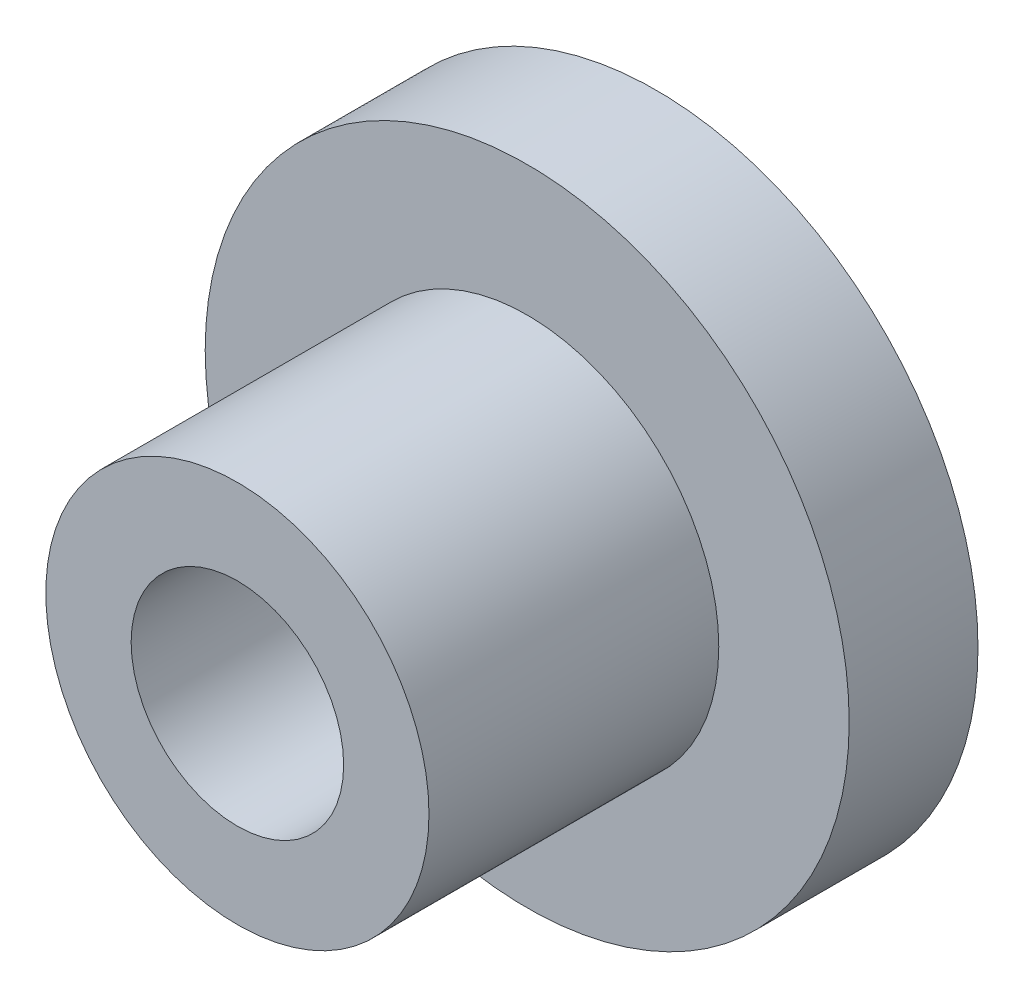
ISO-10303-21;
HEADER;
FILE_DESCRIPTION(('STEP AP214'),'2;1');
FILE_NAME('part.step','',(''),(''),'','','');
FILE_SCHEMA(('AUTOMOTIVE_DESIGN { 1 0 10303 214 1 1 1 1 }'));
ENDSEC;
DATA;
#1=APPLICATION_CONTEXT('core data for automotive mechanical design processes');
#2=APPLICATION_PROTOCOL_DEFINITION('international standard','automotive_design',2000,#1);
#3=PRODUCT_CONTEXT('',#1,'mechanical');
#4=PRODUCT('Part','Part','',(#3));
#5=PRODUCT_RELATED_PRODUCT_CATEGORY('part','',(#4));
#6=PRODUCT_DEFINITION_FORMATION('','',#4);
#7=PRODUCT_DEFINITION_CONTEXT('part definition',#1,'design');
#8=PRODUCT_DEFINITION('design','',#6,#7);
#9=PRODUCT_DEFINITION_SHAPE('','',#8);
#10=(LENGTH_UNIT() NAMED_UNIT(*) SI_UNIT(.MILLI.,.METRE.));
#11=(NAMED_UNIT(*) PLANE_ANGLE_UNIT() SI_UNIT($,.RADIAN.));
#12=(NAMED_UNIT(*) SI_UNIT($,.STERADIAN.) SOLID_ANGLE_UNIT());
#13=UNCERTAINTY_MEASURE_WITH_UNIT(LENGTH_MEASURE(1.E-05),#10,'distance_accuracy_value','');
#14=(GEOMETRIC_REPRESENTATION_CONTEXT(3) GLOBAL_UNCERTAINTY_ASSIGNED_CONTEXT((#13)) GLOBAL_UNIT_ASSIGNED_CONTEXT((#10,
#11,#12)) REPRESENTATION_CONTEXT('',''));
#15=CARTESIAN_POINT('',(0.,0.,0.));
#16=DIRECTION('',(0.,0.,1.));
#17=DIRECTION('',(1.,0.,0.));
#18=AXIS2_PLACEMENT_3D('',#15,#16,#17);
#19=CARTESIAN_POINT('',(2.975,0.,2.00000000001683));
#20=DIRECTION('',(0.,0.,1.));
#21=DIRECTION('',(1.,0.,0.));
#22=AXIS2_PLACEMENT_3D('',#19,#20,#21);
#23=PLANE('',#22);
#24=CARTESIAN_POINT('',(0.,0.,2.00000000001683));
#25=DIRECTION('',(0.,0.,1.));
#26=DIRECTION('',(1.,0.,0.));
#27=AXIS2_PLACEMENT_3D('',#24,#25,#26);
#28=CIRCLE('',#27,5.);
#29=CARTESIAN_POINT('',(5.,0.,2.00000000001683));
#30=VERTEX_POINT('',#29);
#31=EDGE_CURVE('E10',#30,#30,#28,.T.);
#32=ORIENTED_EDGE('',*,*,#31,.T.);
#33=EDGE_LOOP('',(#32));
#34=FACE_BOUND('',#33,.T.);
#35=CARTESIAN_POINT('',(0.,0.,2.00000000001683));
#36=DIRECTION('',(0.,0.,1.));
#37=DIRECTION('',(1.,0.,0.));
#38=AXIS2_PLACEMENT_3D('',#35,#36,#37);
#39=CIRCLE('',#38,2.975);
#40=CARTESIAN_POINT('',(2.975,0.,2.00000000001683));
#41=VERTEX_POINT('',#40);
#42=EDGE_CURVE('E52',#41,#41,#39,.T.);
#43=ORIENTED_EDGE('',*,*,#42,.F.);
#44=EDGE_LOOP('',(#43));
#45=FACE_BOUND('',#44,.T.);
#46=ADVANCED_FACE('F30',(#34,#45),#23,.T.);
#47=CARTESIAN_POINT('',(0.,0.,0.));
#48=DIRECTION('',(0.,0.,1.));
#49=DIRECTION('',(1.,0.,0.));
#50=AXIS2_PLACEMENT_3D('',#47,#48,#49);
#51=CYLINDRICAL_SURFACE('',#50,5.);
#52=CARTESIAN_POINT('',(0.,0.,0.));
#53=DIRECTION('',(0.,0.,1.));
#54=DIRECTION('',(1.,0.,0.));
#55=AXIS2_PLACEMENT_3D('',#52,#53,#54);
#56=CIRCLE('',#55,5.);
#57=CARTESIAN_POINT('',(5.,0.,0.));
#58=VERTEX_POINT('',#57);
#59=EDGE_CURVE('E36',#58,#58,#56,.T.);
#60=ORIENTED_EDGE('',*,*,#59,.T.);
#61=EDGE_LOOP('',(#60));
#62=FACE_BOUND('',#61,.T.);
#63=ORIENTED_EDGE('',*,*,#31,.F.);
#64=EDGE_LOOP('',(#63));
#65=FACE_BOUND('',#64,.T.);
#66=ADVANCED_FACE('F60',(#62,#65),#51,.T.);
#67=CARTESIAN_POINT('',(5.,0.,0.));
#68=DIRECTION('',(0.,0.,-1.));
#69=DIRECTION('',(-1.,0.,0.));
#70=AXIS2_PLACEMENT_3D('',#67,#68,#69);
#71=PLANE('',#70);
#72=CARTESIAN_POINT('',(0.,0.,0.));
#73=DIRECTION('',(0.,0.,1.));
#74=DIRECTION('',(1.,0.,0.));
#75=AXIS2_PLACEMENT_3D('',#72,#73,#74);
#76=CIRCLE('',#75,1.65);
#77=CARTESIAN_POINT('',(1.65,0.,0.));
#78=VERTEX_POINT('',#77);
#79=EDGE_CURVE('E40',#78,#78,#76,.T.);
#80=ORIENTED_EDGE('',*,*,#79,.T.);
#81=EDGE_LOOP('',(#80));
#82=FACE_BOUND('',#81,.T.);
#83=ORIENTED_EDGE('',*,*,#59,.F.);
#84=EDGE_LOOP('',(#83));
#85=FACE_BOUND('',#84,.T.);
#86=ADVANCED_FACE('F64',(#82,#85),#71,.T.);
#87=CARTESIAN_POINT('',(0.,0.,0.));
#88=DIRECTION('',(0.,0.,1.));
#89=DIRECTION('',(1.,0.,0.));
#90=AXIS2_PLACEMENT_3D('',#87,#88,#89);
#91=CYLINDRICAL_SURFACE('',#90,1.65);
#92=CARTESIAN_POINT('',(0.,0.,6.50000000001683));
#93=DIRECTION('',(0.,0.,1.));
#94=DIRECTION('',(1.,0.,0.));
#95=AXIS2_PLACEMENT_3D('',#92,#93,#94);
#96=CIRCLE('',#95,1.65);
#97=CARTESIAN_POINT('',(1.65,0.,6.50000000001683));
#98=VERTEX_POINT('',#97);
#99=EDGE_CURVE('E44',#98,#98,#96,.T.);
#100=ORIENTED_EDGE('',*,*,#99,.T.);
#101=EDGE_LOOP('',(#100));
#102=FACE_BOUND('',#101,.T.);
#103=ORIENTED_EDGE('',*,*,#79,.F.);
#104=EDGE_LOOP('',(#103));
#105=FACE_BOUND('',#104,.T.);
#106=ADVANCED_FACE('F68',(#102,#105),#91,.F.);
#107=CARTESIAN_POINT('',(1.65,0.,6.50000000001683));
#108=DIRECTION('',(0.,0.,1.));
#109=DIRECTION('',(1.,0.,0.));
#110=AXIS2_PLACEMENT_3D('',#107,#108,#109);
#111=PLANE('',#110);
#112=CARTESIAN_POINT('',(0.,0.,6.50000000001683));
#113=DIRECTION('',(0.,0.,1.));
#114=DIRECTION('',(1.,0.,0.));
#115=AXIS2_PLACEMENT_3D('',#112,#113,#114);
#116=CIRCLE('',#115,2.975);
#117=CARTESIAN_POINT('',(2.975,0.,6.50000000001683));
#118=VERTEX_POINT('',#117);
#119=EDGE_CURVE('E49',#118,#118,#116,.T.);
#120=ORIENTED_EDGE('',*,*,#119,.T.);
#121=EDGE_LOOP('',(#120));
#122=FACE_BOUND('',#121,.T.);
#123=ORIENTED_EDGE('',*,*,#99,.F.);
#124=EDGE_LOOP('',(#123));
#125=FACE_BOUND('',#124,.T.);
#126=ADVANCED_FACE('F75',(#122,#125),#111,.T.);
#127=CARTESIAN_POINT('',(0.,0.,0.));
#128=DIRECTION('',(0.,0.,1.));
#129=DIRECTION('',(1.,0.,0.));
#130=AXIS2_PLACEMENT_3D('',#127,#128,#129);
#131=CYLINDRICAL_SURFACE('',#130,2.975);
#132=ORIENTED_EDGE('',*,*,#42,.T.);
#133=EDGE_LOOP('',(#132));
#134=FACE_BOUND('',#133,.T.);
#135=ORIENTED_EDGE('',*,*,#119,.F.);
#136=EDGE_LOOP('',(#135));
#137=FACE_BOUND('',#136,.T.);
#138=ADVANCED_FACE('F56',(#134,#137),#131,.T.);
#139=CLOSED_SHELL('',(#46,#66,#86,#106,#126,#138));
#140=MANIFOLD_SOLID_BREP('B2',#139);
#141=ADVANCED_BREP_SHAPE_REPRESENTATION('',(#18,#140),#14);
#142=SHAPE_DEFINITION_REPRESENTATION(#9,#141);
ENDSEC;
END-ISO-10303-21;
